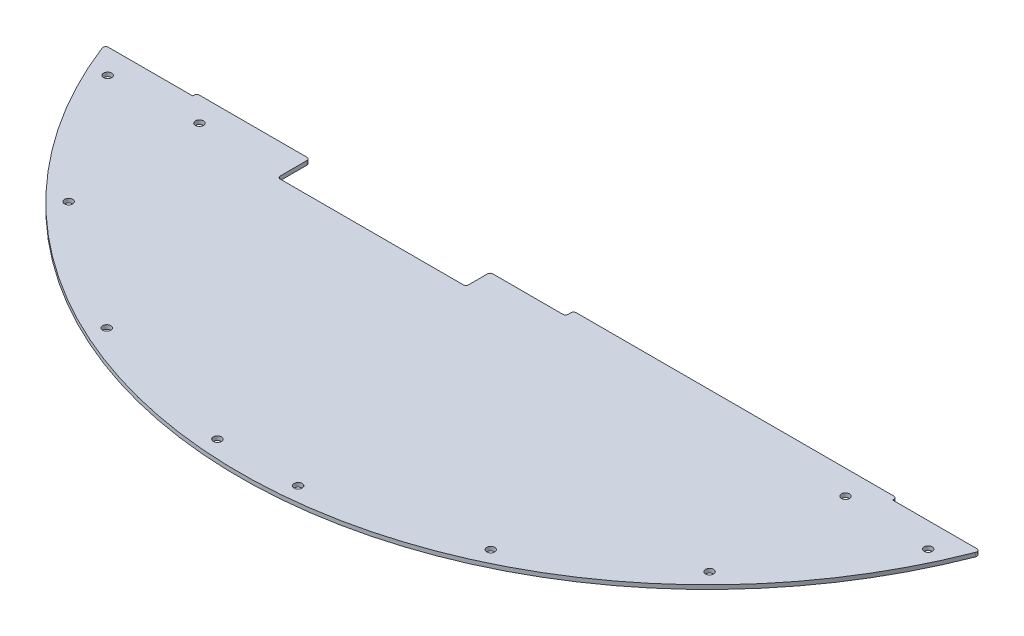
ISO-10303-21;
HEADER;
FILE_DESCRIPTION(('STEP AP214'),'2;1');
FILE_NAME('part.step','',(''),(''),'','','');
FILE_SCHEMA(('AUTOMOTIVE_DESIGN { 1 0 10303 214 1 1 1 1 }'));
ENDSEC;
DATA;
#1=APPLICATION_CONTEXT('core data for automotive mechanical design processes');
#2=APPLICATION_PROTOCOL_DEFINITION('international standard','automotive_design',2000,#1);
#3=PRODUCT_CONTEXT('',#1,'mechanical');
#4=PRODUCT('Part','Part','',(#3));
#5=PRODUCT_RELATED_PRODUCT_CATEGORY('part','',(#4));
#6=PRODUCT_DEFINITION_FORMATION('','',#4);
#7=PRODUCT_DEFINITION_CONTEXT('part definition',#1,'design');
#8=PRODUCT_DEFINITION('design','',#6,#7);
#9=PRODUCT_DEFINITION_SHAPE('','',#8);
#10=(LENGTH_UNIT() NAMED_UNIT(*) SI_UNIT(.MILLI.,.METRE.));
#11=(NAMED_UNIT(*) PLANE_ANGLE_UNIT() SI_UNIT($,.RADIAN.));
#12=(NAMED_UNIT(*) SI_UNIT($,.STERADIAN.) SOLID_ANGLE_UNIT());
#13=UNCERTAINTY_MEASURE_WITH_UNIT(LENGTH_MEASURE(1.E-05),#10,'distance_accuracy_value','');
#14=(GEOMETRIC_REPRESENTATION_CONTEXT(3) GLOBAL_UNCERTAINTY_ASSIGNED_CONTEXT((#13)) GLOBAL_UNIT_ASSIGNED_CONTEXT((#10,
#11,#12)) REPRESENTATION_CONTEXT('',''));
#15=CARTESIAN_POINT('',(0.,0.,0.));
#16=DIRECTION('',(0.,0.,1.));
#17=DIRECTION('',(1.,0.,0.));
#18=AXIS2_PLACEMENT_3D('',#15,#16,#17);
#19=CARTESIAN_POINT('',(-130.,1.5,60.));
#20=DIRECTION('',(0.,0.,1.));
#21=DIRECTION('',(1.,0.,0.));
#22=AXIS2_PLACEMENT_3D('',#19,#20,#21);
#23=PLANE('',#22);
#24=DIRECTION('',(-1.,0.,0.));
#25=VECTOR('',#24,1.);
#26=CARTESIAN_POINT('',(-130.,1.5,60.));
#27=LINE('',#26,#25);
#28=CARTESIAN_POINT('',(-89.,1.5,60.));
#29=VERTEX_POINT('',#28);
#30=CARTESIAN_POINT('',(-129.,1.5,60.));
#31=VERTEX_POINT('',#30);
#32=EDGE_CURVE('E412',#29,#31,#27,.T.);
#33=ORIENTED_EDGE('',*,*,#32,.F.);
#34=DIRECTION('',(0.,1.,0.));
#35=VECTOR('',#34,1.);
#36=CARTESIAN_POINT('',(-89.,1.5,60.));
#37=LINE('',#36,#35);
#38=CARTESIAN_POINT('',(-89.,0.,60.));
#39=VERTEX_POINT('',#38);
#40=EDGE_CURVE('E290',#29,#39,#37,.F.);
#41=ORIENTED_EDGE('',*,*,#40,.T.);
#42=DIRECTION('',(-1.,0.,0.));
#43=VECTOR('',#42,1.);
#44=CARTESIAN_POINT('',(-130.,0.,60.));
#45=LINE('',#44,#43);
#46=CARTESIAN_POINT('',(-129.,0.,60.));
#47=VERTEX_POINT('',#46);
#48=EDGE_CURVE('E424',#39,#47,#45,.T.);
#49=ORIENTED_EDGE('',*,*,#48,.T.);
#50=DIRECTION('',(0.,-1.,0.));
#51=VECTOR('',#50,1.);
#52=CARTESIAN_POINT('',(-129.,1.5,60.));
#53=LINE('',#52,#51);
#54=EDGE_CURVE('E231',#47,#31,#53,.F.);
#55=ORIENTED_EDGE('',*,*,#54,.T.);
#56=EDGE_LOOP('',(#33,#41,#49,#55));
#57=FACE_BOUND('',#56,.T.);
#58=ADVANCED_FACE('F32',(#57),#23,.F.);
#59=CARTESIAN_POINT('',(0.,1.5,0.));
#60=DIRECTION('',(0.,1.,0.));
#61=DIRECTION('',(0.,0.,1.));
#62=AXIS2_PLACEMENT_3D('',#59,#60,#61);
#63=PLANE('',#62);
#64=CARTESIAN_POINT('',(129.,1.5,60.));
#65=VERTEX_POINT('',#64);
#66=CARTESIAN_POINT('',(11.,1.5,60.));
#67=VERTEX_POINT('',#66);
#68=EDGE_CURVE('E216',#65,#67,#27,.T.);
#69=ORIENTED_EDGE('',*,*,#68,.T.);
#70=CARTESIAN_POINT('',(11.,1.5,61.));
#71=DIRECTION('',(0.,1.,0.));
#72=DIRECTION('',(0.,0.,1.));
#73=AXIS2_PLACEMENT_3D('',#70,#71,#72);
#74=CIRCLE('',#73,1.);
#75=CARTESIAN_POINT('',(10.,1.5,61.));
#76=VERTEX_POINT('',#75);
#77=EDGE_CURVE('E259',#67,#76,#74,.T.);
#78=ORIENTED_EDGE('',*,*,#77,.T.);
#79=DIRECTION('',(0.,0.,-1.));
#80=VECTOR('',#79,1.);
#81=CARTESIAN_POINT('',(10.,1.5,60.));
#82=LINE('',#81,#80);
#83=CARTESIAN_POINT('',(10.,1.5,62.));
#84=VERTEX_POINT('',#83);
#85=EDGE_CURVE('E331',#84,#76,#82,.T.);
#86=ORIENTED_EDGE('',*,*,#85,.F.);
#87=CARTESIAN_POINT('',(9.00000000000001,1.5,62.));
#88=DIRECTION('',(0.,1.,0.));
#89=DIRECTION('',(0.,0.,1.));
#90=AXIS2_PLACEMENT_3D('',#87,#88,#89);
#91=CIRCLE('',#90,1.);
#92=CARTESIAN_POINT('',(9.00000000000001,1.5,63.));
#93=VERTEX_POINT('',#92);
#94=EDGE_CURVE('E292',#84,#93,#91,.F.);
#95=ORIENTED_EDGE('',*,*,#94,.T.);
#96=DIRECTION('',(1.,0.,0.));
#97=VECTOR('',#96,1.);
#98=CARTESIAN_POINT('',(10.,1.5,63.));
#99=LINE('',#98,#97);
#100=CARTESIAN_POINT('',(-17.,1.5,63.));
#101=VERTEX_POINT('',#100);
#102=EDGE_CURVE('E342',#101,#93,#99,.T.);
#103=ORIENTED_EDGE('',*,*,#102,.F.);
#104=CARTESIAN_POINT('',(-17.,1.5,64.));
#105=DIRECTION('',(0.,1.,0.));
#106=DIRECTION('',(0.,0.,1.));
#107=AXIS2_PLACEMENT_3D('',#104,#105,#106);
#108=CIRCLE('',#107,1.);
#109=CARTESIAN_POINT('',(-18.,1.5,64.));
#110=VERTEX_POINT('',#109);
#111=EDGE_CURVE('E257',#101,#110,#108,.T.);
#112=ORIENTED_EDGE('',*,*,#111,.T.);
#113=DIRECTION('',(0.,0.,-1.));
#114=VECTOR('',#113,1.);
#115=CARTESIAN_POINT('',(-18.,1.5,72.));
#116=LINE('',#115,#114);
#117=CARTESIAN_POINT('',(-18.,1.5,71.));
#118=VERTEX_POINT('',#117);
#119=EDGE_CURVE('E339',#118,#110,#116,.T.);
#120=ORIENTED_EDGE('',*,*,#119,.F.);
#121=CARTESIAN_POINT('',(-19.,1.5,71.));
#122=DIRECTION('',(0.,1.,0.));
#123=DIRECTION('',(0.,0.,1.));
#124=AXIS2_PLACEMENT_3D('',#121,#122,#123);
#125=CIRCLE('',#124,1.);
#126=CARTESIAN_POINT('',(-19.,1.5,72.));
#127=VERTEX_POINT('',#126);
#128=EDGE_CURVE('E296',#118,#127,#125,.F.);
#129=ORIENTED_EDGE('',*,*,#128,.T.);
#130=DIRECTION('',(1.,0.,0.));
#131=VECTOR('',#130,1.);
#132=CARTESIAN_POINT('',(-88.,1.5,72.));
#133=LINE('',#132,#131);
#134=CARTESIAN_POINT('',(-87.,1.5,72.));
#135=VERTEX_POINT('',#134);
#136=EDGE_CURVE('E304',#135,#127,#133,.T.);
#137=ORIENTED_EDGE('',*,*,#136,.F.);
#138=CARTESIAN_POINT('',(-87.,1.5,71.));
#139=DIRECTION('',(0.,1.,0.));
#140=DIRECTION('',(0.,0.,1.));
#141=AXIS2_PLACEMENT_3D('',#138,#139,#140);
#142=CIRCLE('',#141,1.);
#143=CARTESIAN_POINT('',(-88.,1.5,71.));
#144=VERTEX_POINT('',#143);
#145=EDGE_CURVE('E40',#135,#144,#142,.F.);
#146=ORIENTED_EDGE('',*,*,#145,.T.);
#147=DIRECTION('',(0.,0.,1.));
#148=VECTOR('',#147,1.);
#149=CARTESIAN_POINT('',(-88.,1.5,60.));
#150=LINE('',#149,#148);
#151=CARTESIAN_POINT('',(-88.,1.5,61.));
#152=VERTEX_POINT('',#151);
#153=EDGE_CURVE('E302',#152,#144,#150,.T.);
#154=ORIENTED_EDGE('',*,*,#153,.F.);
#155=CARTESIAN_POINT('',(-89.,1.5,61.));
#156=DIRECTION('',(0.,1.,0.));
#157=DIRECTION('',(0.,0.,1.));
#158=AXIS2_PLACEMENT_3D('',#155,#156,#157);
#159=CIRCLE('',#158,1.);
#160=EDGE_CURVE('E255',#152,#29,#159,.T.);
#161=ORIENTED_EDGE('',*,*,#160,.T.);
#162=ORIENTED_EDGE('',*,*,#32,.T.);
#163=CARTESIAN_POINT('',(-129.,1.5,61.));
#164=DIRECTION('',(0.,1.,0.));
#165=DIRECTION('',(0.,0.,1.));
#166=AXIS2_PLACEMENT_3D('',#163,#164,#165);
#167=CIRCLE('',#166,1.);
#168=CARTESIAN_POINT('',(-130.,1.5,61.));
#169=VERTEX_POINT('',#168);
#170=EDGE_CURVE('E190',#31,#169,#167,.T.);
#171=ORIENTED_EDGE('',*,*,#170,.T.);
#172=DIRECTION('',(0.,0.,1.));
#173=VECTOR('',#172,1.);
#174=CARTESIAN_POINT('',(-130.,1.5,60.));
#175=LINE('',#174,#173);
#176=CARTESIAN_POINT('',(-130.,1.5,61.5));
#177=VERTEX_POINT('',#176);
#178=EDGE_CURVE('E182',#169,#177,#175,.T.);
#179=ORIENTED_EDGE('',*,*,#178,.T.);
#180=DIRECTION('',(-1.,0.,0.));
#181=VECTOR('',#180,1.);
#182=CARTESIAN_POINT('',(-162.76900810658,1.5,61.5));
#183=LINE('',#182,#181);
#184=CARTESIAN_POINT('',(-161.315684296351,1.5,61.5));
#185=VERTEX_POINT('',#184);
#186=EDGE_CURVE('E187',#177,#185,#183,.T.);
#187=ORIENTED_EDGE('',*,*,#186,.T.);
#188=CARTESIAN_POINT('',(-161.315684296351,1.5,62.5));
#189=DIRECTION('',(0.,1.,0.));
#190=DIRECTION('',(0.,0.,1.));
#191=AXIS2_PLACEMENT_3D('',#188,#189,#190);
#192=CIRCLE('',#191,1.);
#193=CARTESIAN_POINT('',(-162.24814489922,1.5,62.8612716763006));
#194=VERTEX_POINT('',#193);
#195=EDGE_CURVE('E238',#185,#194,#192,.T.);
#196=ORIENTED_EDGE('',*,*,#195,.T.);
#197=CARTESIAN_POINT('',(0.,1.5,0.));
#198=DIRECTION('',(0.,1.,0.));
#199=DIRECTION('',(0.,0.,1.));
#200=AXIS2_PLACEMENT_3D('',#197,#198,#199);
#201=CIRCLE('',#200,174.);
#202=CARTESIAN_POINT('',(162.24814489922,1.5,62.8612716763006));
#203=VERTEX_POINT('',#202);
#204=EDGE_CURVE('E204',#194,#203,#201,.T.);
#205=ORIENTED_EDGE('',*,*,#204,.T.);
#206=CARTESIAN_POINT('',(161.315684296351,1.5,62.5));
#207=DIRECTION('',(0.,1.,0.));
#208=DIRECTION('',(0.,0.,1.));
#209=AXIS2_PLACEMENT_3D('',#206,#207,#208);
#210=CIRCLE('',#209,1.);
#211=CARTESIAN_POINT('',(161.315684296351,1.5,61.5));
#212=VERTEX_POINT('',#211);
#213=EDGE_CURVE('E234',#203,#212,#210,.T.);
#214=ORIENTED_EDGE('',*,*,#213,.T.);
#215=DIRECTION('',(-1.,0.,0.));
#216=VECTOR('',#215,1.);
#217=CARTESIAN_POINT('',(162.76900810658,1.5,61.5));
#218=LINE('',#217,#216);
#219=CARTESIAN_POINT('',(130.,1.5,61.5));
#220=VERTEX_POINT('',#219);
#221=EDGE_CURVE('E407',#212,#220,#218,.T.);
#222=ORIENTED_EDGE('',*,*,#221,.T.);
#223=DIRECTION('',(0.,0.,-1.));
#224=VECTOR('',#223,1.);
#225=CARTESIAN_POINT('',(130.,1.5,60.));
#226=LINE('',#225,#224);
#227=CARTESIAN_POINT('',(130.,1.5,61.));
#228=VERTEX_POINT('',#227);
#229=EDGE_CURVE('E409',#220,#228,#226,.T.);
#230=ORIENTED_EDGE('',*,*,#229,.T.);
#231=CARTESIAN_POINT('',(129.,1.5,61.));
#232=DIRECTION('',(0.,1.,0.));
#233=DIRECTION('',(0.,0.,1.));
#234=AXIS2_PLACEMENT_3D('',#231,#232,#233);
#235=CIRCLE('',#234,1.);
#236=EDGE_CURVE('E236',#228,#65,#235,.T.);
#237=ORIENTED_EDGE('',*,*,#236,.T.);
#238=EDGE_LOOP('',(#69,#78,#86,#95,#103,#112,#120,#129,#137,#146,#154,#161,#162,#171,#179,#187,
#196,#205,#214,#222,#230,#237));
#239=FACE_BOUND('',#238,.T.);
#240=CARTESIAN_POINT('',(15.,1.5,167.329017208612));
#241=DIRECTION('',(0.,-1.,0.));
#242=DIRECTION('',(0.,0.,1.));
#243=AXIS2_PLACEMENT_3D('',#240,#241,#242);
#244=CIRCLE('',#243,1.5);
#245=CARTESIAN_POINT('',(15.,1.5,168.829017208612));
#246=VERTEX_POINT('',#245);
#247=EDGE_CURVE('E350',#246,#246,#244,.T.);
#248=ORIENTED_EDGE('',*,*,#247,.T.);
#249=EDGE_LOOP('',(#248));
#250=FACE_BOUND('',#249,.T.);
#251=CARTESIAN_POINT('',(71.3252837600215,1.5,152.107540564406));
#252=DIRECTION('',(0.,-1.,0.));
#253=DIRECTION('',(0.342020143325669,0.,0.939692620785908));
#254=AXIS2_PLACEMENT_3D('',#251,#252,#253);
#255=CIRCLE('',#254,1.5);
#256=CARTESIAN_POINT('',(71.83831397501,1.5,153.517079495585));
#257=VERTEX_POINT('',#256);
#258=EDGE_CURVE('E356',#257,#257,#255,.T.);
#259=ORIENTED_EDGE('',*,*,#258,.T.);
#260=EDGE_LOOP('',(#259));
#261=FACE_BOUND('',#260,.T.);
#262=CARTESIAN_POINT('',(119.047685649506,1.5,118.539649659919));
#263=DIRECTION('',(0.,-1.,0.));
#264=DIRECTION('',(0.642787609686541,0.,0.766044443118977));
#265=AXIS2_PLACEMENT_3D('',#262,#263,#264);
#266=CIRCLE('',#265,1.5);
#267=CARTESIAN_POINT('',(120.011867064036,1.5,119.688716324597));
#268=VERTEX_POINT('',#267);
#269=EDGE_CURVE('E362',#268,#268,#266,.T.);
#270=ORIENTED_EDGE('',*,*,#269,.T.);
#271=EDGE_LOOP('',(#270));
#272=FACE_BOUND('',#271,.T.);
#273=CARTESIAN_POINT('',(152.411179692942,1.5,70.6741275475391));
#274=DIRECTION('',(0.,-1.,0.));
#275=DIRECTION('',(0.86602540378444,0.,0.499999999999998));
#276=AXIS2_PLACEMENT_3D('',#273,#274,#275);
#277=CIRCLE('',#276,1.5);
#278=CARTESIAN_POINT('',(153.710217798618,1.5,71.4241275475391));
#279=VERTEX_POINT('',#278);
#280=EDGE_CURVE('E336',#279,#279,#277,.T.);
#281=ORIENTED_EDGE('',*,*,#280,.T.);
#282=EDGE_LOOP('',(#281));
#283=FACE_BOUND('',#282,.T.);
#284=CARTESIAN_POINT('',(-71.3252837600215,1.5,152.107540564406));
#285=DIRECTION('',(0.,1.,0.));
#286=DIRECTION('',(-0.342020143325669,0.,0.939692620785908));
#287=AXIS2_PLACEMENT_3D('',#284,#285,#286);
#288=CIRCLE('',#287,1.5);
#289=CARTESIAN_POINT('',(-71.83831397501,1.5,153.517079495585));
#290=VERTEX_POINT('',#289);
#291=EDGE_CURVE('E374',#290,#290,#288,.T.);
#292=ORIENTED_EDGE('',*,*,#291,.F.);
#293=EDGE_LOOP('',(#292));
#294=FACE_BOUND('',#293,.T.);
#295=CARTESIAN_POINT('',(-119.047685649506,1.5,118.539649659919));
#296=DIRECTION('',(0.,1.,0.));
#297=DIRECTION('',(-0.642787609686541,0.,0.766044443118977));
#298=AXIS2_PLACEMENT_3D('',#295,#296,#297);
#299=CIRCLE('',#298,1.5);
#300=CARTESIAN_POINT('',(-120.011867064036,1.5,119.688716324597));
#301=VERTEX_POINT('',#300);
#302=EDGE_CURVE('E380',#301,#301,#299,.T.);
#303=ORIENTED_EDGE('',*,*,#302,.F.);
#304=EDGE_LOOP('',(#303));
#305=FACE_BOUND('',#304,.T.);
#306=CARTESIAN_POINT('',(-152.411179692942,1.5,70.6741275475391));
#307=DIRECTION('',(0.,1.,0.));
#308=DIRECTION('',(-0.86602540378444,0.,0.499999999999998));
#309=AXIS2_PLACEMENT_3D('',#306,#307,#308);
#310=CIRCLE('',#309,1.5);
#311=CARTESIAN_POINT('',(-153.710217798618,1.5,71.4241275475391));
#312=VERTEX_POINT('',#311);
#313=EDGE_CURVE('E349',#312,#312,#310,.T.);
#314=ORIENTED_EDGE('',*,*,#313,.F.);
#315=EDGE_LOOP('',(#314));
#316=FACE_BOUND('',#315,.T.);
#317=CARTESIAN_POINT('',(-15.,1.5,167.329017208612));
#318=DIRECTION('',(0.,1.,0.));
#319=DIRECTION('',(0.,0.,1.));
#320=AXIS2_PLACEMENT_3D('',#317,#318,#319);
#321=CIRCLE('',#320,1.5);
#322=CARTESIAN_POINT('',(-15.,1.5,168.829017208612));
#323=VERTEX_POINT('',#322);
#324=EDGE_CURVE('E373',#323,#323,#321,.T.);
#325=ORIENTED_EDGE('',*,*,#324,.F.);
#326=EDGE_LOOP('',(#325));
#327=FACE_BOUND('',#326,.T.);
#328=CARTESIAN_POINT('',(-120.,1.5,69.));
#329=DIRECTION('',(0.,1.,0.));
#330=DIRECTION('',(0.,0.,1.));
#331=AXIS2_PLACEMENT_3D('',#328,#329,#330);
#332=CIRCLE('',#331,1.5);
#333=CARTESIAN_POINT('',(-120.,1.5,70.5));
#334=VERTEX_POINT('',#333);
#335=EDGE_CURVE('E400',#334,#334,#332,.T.);
#336=ORIENTED_EDGE('',*,*,#335,.F.);
#337=EDGE_LOOP('',(#336));
#338=FACE_BOUND('',#337,.T.);
#339=CARTESIAN_POINT('',(120.,1.5,69.));
#340=DIRECTION('',(0.,1.,0.));
#341=DIRECTION('',(0.,0.,-1.));
#342=AXIS2_PLACEMENT_3D('',#339,#340,#341);
#343=CIRCLE('',#342,1.5);
#344=CARTESIAN_POINT('',(120.,1.5,67.5));
#345=VERTEX_POINT('',#344);
#346=EDGE_CURVE('E394',#345,#345,#343,.T.);
#347=ORIENTED_EDGE('',*,*,#346,.F.);
#348=EDGE_LOOP('',(#347));
#349=FACE_BOUND('',#348,.T.);
#350=ADVANCED_FACE('F185',(#239,#250,#261,#272,#283,#294,#305,#316,#327,#338,#349),#63,.T.);
#351=CARTESIAN_POINT('',(0.,0.,0.));
#352=DIRECTION('',(0.,1.,0.));
#353=DIRECTION('',(0.,0.,1.));
#354=AXIS2_PLACEMENT_3D('',#351,#352,#353);
#355=PLANE('',#354);
#356=DIRECTION('',(0.,0.,-1.));
#357=VECTOR('',#356,1.);
#358=CARTESIAN_POINT('',(10.,0.,60.));
#359=LINE('',#358,#357);
#360=CARTESIAN_POINT('',(10.,0.,62.));
#361=VERTEX_POINT('',#360);
#362=CARTESIAN_POINT('',(10.,0.,61.));
#363=VERTEX_POINT('',#362);
#364=EDGE_CURVE('E335',#361,#363,#359,.T.);
#365=ORIENTED_EDGE('',*,*,#364,.T.);
#366=CARTESIAN_POINT('',(11.,0.,61.));
#367=DIRECTION('',(0.,1.,0.));
#368=DIRECTION('',(0.,0.,1.));
#369=AXIS2_PLACEMENT_3D('',#366,#367,#368);
#370=CIRCLE('',#369,1.);
#371=CARTESIAN_POINT('',(11.,0.,60.));
#372=VERTEX_POINT('',#371);
#373=EDGE_CURVE('E269',#363,#372,#370,.F.);
#374=ORIENTED_EDGE('',*,*,#373,.T.);
#375=CARTESIAN_POINT('',(129.,0.,60.));
#376=VERTEX_POINT('',#375);
#377=EDGE_CURVE('E195',#376,#372,#45,.T.);
#378=ORIENTED_EDGE('',*,*,#377,.F.);
#379=CARTESIAN_POINT('',(129.,0.,61.));
#380=DIRECTION('',(0.,1.,0.));
#381=DIRECTION('',(0.,0.,1.));
#382=AXIS2_PLACEMENT_3D('',#379,#380,#381);
#383=CIRCLE('',#382,1.);
#384=CARTESIAN_POINT('',(130.,0.,61.));
#385=VERTEX_POINT('',#384);
#386=EDGE_CURVE('E221',#376,#385,#383,.F.);
#387=ORIENTED_EDGE('',*,*,#386,.T.);
#388=DIRECTION('',(0.,0.,-1.));
#389=VECTOR('',#388,1.);
#390=CARTESIAN_POINT('',(130.,0.,60.));
#391=LINE('',#390,#389);
#392=CARTESIAN_POINT('',(130.,0.,61.5));
#393=VERTEX_POINT('',#392);
#394=EDGE_CURVE('E422',#393,#385,#391,.T.);
#395=ORIENTED_EDGE('',*,*,#394,.F.);
#396=DIRECTION('',(-1.,0.,0.));
#397=VECTOR('',#396,1.);
#398=CARTESIAN_POINT('',(162.76900810658,0.,61.5));
#399=LINE('',#398,#397);
#400=CARTESIAN_POINT('',(161.315684296351,0.,61.5));
#401=VERTEX_POINT('',#400);
#402=EDGE_CURVE('E420',#401,#393,#399,.T.);
#403=ORIENTED_EDGE('',*,*,#402,.F.);
#404=CARTESIAN_POINT('',(161.315684296351,0.,62.5));
#405=DIRECTION('',(0.,1.,0.));
#406=DIRECTION('',(0.,0.,1.));
#407=AXIS2_PLACEMENT_3D('',#404,#405,#406);
#408=CIRCLE('',#407,1.);
#409=CARTESIAN_POINT('',(162.24814489922,0.,62.8612716763006));
#410=VERTEX_POINT('',#409);
#411=EDGE_CURVE('E213',#401,#410,#408,.F.);
#412=ORIENTED_EDGE('',*,*,#411,.T.);
#413=CARTESIAN_POINT('',(0.,0.,0.));
#414=DIRECTION('',(0.,1.,0.));
#415=DIRECTION('',(0.,0.,1.));
#416=AXIS2_PLACEMENT_3D('',#413,#414,#415);
#417=CIRCLE('',#416,174.);
#418=CARTESIAN_POINT('',(-162.24814489922,0.,62.8612716763006));
#419=VERTEX_POINT('',#418);
#420=EDGE_CURVE('E417',#419,#410,#417,.T.);
#421=ORIENTED_EDGE('',*,*,#420,.F.);
#422=CARTESIAN_POINT('',(-161.315684296351,0.,62.5));
#423=DIRECTION('',(0.,1.,0.));
#424=DIRECTION('',(0.,0.,1.));
#425=AXIS2_PLACEMENT_3D('',#422,#423,#424);
#426=CIRCLE('',#425,1.);
#427=CARTESIAN_POINT('',(-161.315684296351,0.,61.5));
#428=VERTEX_POINT('',#427);
#429=EDGE_CURVE('E223',#419,#428,#426,.F.);
#430=ORIENTED_EDGE('',*,*,#429,.T.);
#431=DIRECTION('',(-1.,0.,0.));
#432=VECTOR('',#431,1.);
#433=CARTESIAN_POINT('',(-162.76900810658,0.,61.5));
#434=LINE('',#433,#432);
#435=CARTESIAN_POINT('',(-130.,0.,61.5));
#436=VERTEX_POINT('',#435);
#437=EDGE_CURVE('E415',#436,#428,#434,.T.);
#438=ORIENTED_EDGE('',*,*,#437,.F.);
#439=DIRECTION('',(0.,0.,1.));
#440=VECTOR('',#439,1.);
#441=CARTESIAN_POINT('',(-130.,0.,60.));
#442=LINE('',#441,#440);
#443=CARTESIAN_POINT('',(-130.,0.,61.));
#444=VERTEX_POINT('',#443);
#445=EDGE_CURVE('E208',#444,#436,#442,.T.);
#446=ORIENTED_EDGE('',*,*,#445,.F.);
#447=CARTESIAN_POINT('',(-129.,0.,61.));
#448=DIRECTION('',(0.,1.,0.));
#449=DIRECTION('',(0.,0.,1.));
#450=AXIS2_PLACEMENT_3D('',#447,#448,#449);
#451=CIRCLE('',#450,1.);
#452=EDGE_CURVE('E225',#444,#47,#451,.F.);
#453=ORIENTED_EDGE('',*,*,#452,.T.);
#454=ORIENTED_EDGE('',*,*,#48,.F.);
#455=CARTESIAN_POINT('',(-89.,0.,61.));
#456=DIRECTION('',(0.,1.,0.));
#457=DIRECTION('',(0.,0.,1.));
#458=AXIS2_PLACEMENT_3D('',#455,#456,#457);
#459=CIRCLE('',#458,1.);
#460=CARTESIAN_POINT('',(-88.,0.,61.));
#461=VERTEX_POINT('',#460);
#462=EDGE_CURVE('E266',#39,#461,#459,.F.);
#463=ORIENTED_EDGE('',*,*,#462,.T.);
#464=DIRECTION('',(0.,0.,1.));
#465=VECTOR('',#464,1.);
#466=CARTESIAN_POINT('',(-88.,0.,60.));
#467=LINE('',#466,#465);
#468=CARTESIAN_POINT('',(-88.,0.,71.));
#469=VERTEX_POINT('',#468);
#470=EDGE_CURVE('E323',#461,#469,#467,.T.);
#471=ORIENTED_EDGE('',*,*,#470,.T.);
#472=CARTESIAN_POINT('',(-87.,0.,71.));
#473=DIRECTION('',(0.,1.,0.));
#474=DIRECTION('',(0.,0.,1.));
#475=AXIS2_PLACEMENT_3D('',#472,#473,#474);
#476=CIRCLE('',#475,1.);
#477=CARTESIAN_POINT('',(-87.,0.,72.));
#478=VERTEX_POINT('',#477);
#479=EDGE_CURVE('E11',#469,#478,#476,.T.);
#480=ORIENTED_EDGE('',*,*,#479,.T.);
#481=DIRECTION('',(1.,0.,0.));
#482=VECTOR('',#481,1.);
#483=CARTESIAN_POINT('',(-88.,0.,72.));
#484=LINE('',#483,#482);
#485=CARTESIAN_POINT('',(-19.,0.,72.));
#486=VERTEX_POINT('',#485);
#487=EDGE_CURVE('E321',#478,#486,#484,.T.);
#488=ORIENTED_EDGE('',*,*,#487,.T.);
#489=CARTESIAN_POINT('',(-19.,0.,71.));
#490=DIRECTION('',(0.,1.,0.));
#491=DIRECTION('',(0.,0.,1.));
#492=AXIS2_PLACEMENT_3D('',#489,#490,#491);
#493=CIRCLE('',#492,1.);
#494=CARTESIAN_POINT('',(-18.,0.,71.));
#495=VERTEX_POINT('',#494);
#496=EDGE_CURVE('E298',#486,#495,#493,.T.);
#497=ORIENTED_EDGE('',*,*,#496,.T.);
#498=DIRECTION('',(0.,0.,-1.));
#499=VECTOR('',#498,1.);
#500=CARTESIAN_POINT('',(-18.,0.,72.));
#501=LINE('',#500,#499);
#502=CARTESIAN_POINT('',(-18.,0.,64.));
#503=VERTEX_POINT('',#502);
#504=EDGE_CURVE('E327',#495,#503,#501,.T.);
#505=ORIENTED_EDGE('',*,*,#504,.T.);
#506=CARTESIAN_POINT('',(-17.,0.,64.));
#507=DIRECTION('',(0.,1.,0.));
#508=DIRECTION('',(0.,0.,1.));
#509=AXIS2_PLACEMENT_3D('',#506,#507,#508);
#510=CIRCLE('',#509,1.);
#511=CARTESIAN_POINT('',(-17.,0.,63.));
#512=VERTEX_POINT('',#511);
#513=EDGE_CURVE('E54',#503,#512,#510,.F.);
#514=ORIENTED_EDGE('',*,*,#513,.T.);
#515=DIRECTION('',(1.,0.,0.));
#516=VECTOR('',#515,1.);
#517=CARTESIAN_POINT('',(10.,0.,63.));
#518=LINE('',#517,#516);
#519=CARTESIAN_POINT('',(9.00000000000001,0.,63.));
#520=VERTEX_POINT('',#519);
#521=EDGE_CURVE('E329',#512,#520,#518,.T.);
#522=ORIENTED_EDGE('',*,*,#521,.T.);
#523=CARTESIAN_POINT('',(9.00000000000001,0.,62.));
#524=DIRECTION('',(0.,1.,0.));
#525=DIRECTION('',(0.,0.,1.));
#526=AXIS2_PLACEMENT_3D('',#523,#524,#525);
#527=CIRCLE('',#526,1.);
#528=EDGE_CURVE('E294',#520,#361,#527,.T.);
#529=ORIENTED_EDGE('',*,*,#528,.T.);
#530=EDGE_LOOP('',(#365,#374,#378,#387,#395,#403,#412,#421,#430,#438,#446,#453,#454,#463,#471,
#480,#488,#497,#505,#514,#522,#529));
#531=FACE_BOUND('',#530,.T.);
#532=CARTESIAN_POINT('',(15.,0.,167.329017208612));
#533=DIRECTION('',(0.,-1.,0.));
#534=DIRECTION('',(0.,0.,1.));
#535=AXIS2_PLACEMENT_3D('',#532,#533,#534);
#536=CIRCLE('',#535,1.5);
#537=CARTESIAN_POINT('',(15.,0.,168.829017208612));
#538=VERTEX_POINT('',#537);
#539=EDGE_CURVE('E346',#538,#538,#536,.T.);
#540=ORIENTED_EDGE('',*,*,#539,.F.);
#541=EDGE_LOOP('',(#540));
#542=FACE_BOUND('',#541,.T.);
#543=CARTESIAN_POINT('',(71.3252837600215,0.,152.107540564406));
#544=DIRECTION('',(0.,-1.,0.));
#545=DIRECTION('',(0.342020143325669,0.,0.939692620785908));
#546=AXIS2_PLACEMENT_3D('',#543,#544,#545);
#547=CIRCLE('',#546,1.5);
#548=CARTESIAN_POINT('',(71.83831397501,0.,153.517079495585));
#549=VERTEX_POINT('',#548);
#550=EDGE_CURVE('E353',#549,#549,#547,.T.);
#551=ORIENTED_EDGE('',*,*,#550,.F.);
#552=EDGE_LOOP('',(#551));
#553=FACE_BOUND('',#552,.T.);
#554=CARTESIAN_POINT('',(119.047685649506,0.,118.539649659919));
#555=DIRECTION('',(0.,-1.,0.));
#556=DIRECTION('',(0.642787609686541,0.,0.766044443118977));
#557=AXIS2_PLACEMENT_3D('',#554,#555,#556);
#558=CIRCLE('',#557,1.5);
#559=CARTESIAN_POINT('',(120.011867064036,0.,119.688716324597));
#560=VERTEX_POINT('',#559);
#561=EDGE_CURVE('E359',#560,#560,#558,.T.);
#562=ORIENTED_EDGE('',*,*,#561,.F.);
#563=EDGE_LOOP('',(#562));
#564=FACE_BOUND('',#563,.T.);
#565=CARTESIAN_POINT('',(152.411179692942,0.,70.6741275475391));
#566=DIRECTION('',(0.,-1.,0.));
#567=DIRECTION('',(0.86602540378444,0.,0.499999999999998));
#568=AXIS2_PLACEMENT_3D('',#565,#566,#567);
#569=CIRCLE('',#568,1.5);
#570=CARTESIAN_POINT('',(153.710217798618,0.,71.4241275475391));
#571=VERTEX_POINT('',#570);
#572=EDGE_CURVE('E365',#571,#571,#569,.T.);
#573=ORIENTED_EDGE('',*,*,#572,.F.);
#574=EDGE_LOOP('',(#573));
#575=FACE_BOUND('',#574,.T.);
#576=CARTESIAN_POINT('',(-71.3252837600215,0.,152.107540564406));
#577=DIRECTION('',(0.,1.,0.));
#578=DIRECTION('',(-0.342020143325669,0.,0.939692620785908));
#579=AXIS2_PLACEMENT_3D('',#576,#577,#578);
#580=CIRCLE('',#579,1.5);
#581=CARTESIAN_POINT('',(-71.83831397501,0.,153.517079495585));
#582=VERTEX_POINT('',#581);
#583=EDGE_CURVE('E370',#582,#582,#580,.T.);
#584=ORIENTED_EDGE('',*,*,#583,.T.);
#585=EDGE_LOOP('',(#584));
#586=FACE_BOUND('',#585,.T.);
#587=CARTESIAN_POINT('',(-119.047685649506,0.,118.539649659919));
#588=DIRECTION('',(0.,1.,0.));
#589=DIRECTION('',(-0.642787609686541,0.,0.766044443118977));
#590=AXIS2_PLACEMENT_3D('',#587,#588,#589);
#591=CIRCLE('',#590,1.5);
#592=CARTESIAN_POINT('',(-120.011867064036,0.,119.688716324597));
#593=VERTEX_POINT('',#592);
#594=EDGE_CURVE('E377',#593,#593,#591,.T.);
#595=ORIENTED_EDGE('',*,*,#594,.T.);
#596=EDGE_LOOP('',(#595));
#597=FACE_BOUND('',#596,.T.);
#598=CARTESIAN_POINT('',(-152.411179692942,0.,70.6741275475391));
#599=DIRECTION('',(0.,1.,0.));
#600=DIRECTION('',(-0.86602540378444,0.,0.499999999999998));
#601=AXIS2_PLACEMENT_3D('',#598,#599,#600);
#602=CIRCLE('',#601,1.5);
#603=CARTESIAN_POINT('',(-153.710217798618,0.,71.4241275475391));
#604=VERTEX_POINT('',#603);
#605=EDGE_CURVE('E383',#604,#604,#602,.T.);
#606=ORIENTED_EDGE('',*,*,#605,.T.);
#607=EDGE_LOOP('',(#606));
#608=FACE_BOUND('',#607,.T.);
#609=CARTESIAN_POINT('',(-15.,0.,167.329017208612));
#610=DIRECTION('',(0.,1.,0.));
#611=DIRECTION('',(0.,0.,1.));
#612=AXIS2_PLACEMENT_3D('',#609,#610,#611);
#613=CIRCLE('',#612,1.5);
#614=CARTESIAN_POINT('',(-15.,0.,168.829017208612));
#615=VERTEX_POINT('',#614);
#616=EDGE_CURVE('E388',#615,#615,#613,.T.);
#617=ORIENTED_EDGE('',*,*,#616,.T.);
#618=EDGE_LOOP('',(#617));
#619=FACE_BOUND('',#618,.T.);
#620=CARTESIAN_POINT('',(-120.,0.,69.));
#621=DIRECTION('',(0.,1.,0.));
#622=DIRECTION('',(0.,0.,1.));
#623=AXIS2_PLACEMENT_3D('',#620,#621,#622);
#624=CIRCLE('',#623,1.5);
#625=CARTESIAN_POINT('',(-120.,0.,70.5));
#626=VERTEX_POINT('',#625);
#627=EDGE_CURVE('E397',#626,#626,#624,.T.);
#628=ORIENTED_EDGE('',*,*,#627,.T.);
#629=EDGE_LOOP('',(#628));
#630=FACE_BOUND('',#629,.T.);
#631=CARTESIAN_POINT('',(120.,0.,69.));
#632=DIRECTION('',(0.,1.,0.));
#633=DIRECTION('',(0.,0.,-1.));
#634=AXIS2_PLACEMENT_3D('',#631,#632,#633);
#635=CIRCLE('',#634,1.5);
#636=CARTESIAN_POINT('',(120.,0.,67.5));
#637=VERTEX_POINT('',#636);
#638=EDGE_CURVE('E391',#637,#637,#635,.T.);
#639=ORIENTED_EDGE('',*,*,#638,.T.);
#640=EDGE_LOOP('',(#639));
#641=FACE_BOUND('',#640,.T.);
#642=ADVANCED_FACE('F319',(#531,#542,#553,#564,#575,#586,#597,#608,#619,#630,#641),#355,.F.);
#643=CARTESIAN_POINT('',(-130.,1.5,60.));
#644=DIRECTION('',(1.,0.,0.));
#645=DIRECTION('',(0.,0.,-1.));
#646=AXIS2_PLACEMENT_3D('',#643,#644,#645);
#647=PLANE('',#646);
#648=ORIENTED_EDGE('',*,*,#178,.F.);
#649=DIRECTION('',(0.,-1.,0.));
#650=VECTOR('',#649,1.);
#651=CARTESIAN_POINT('',(-130.,1.5,61.));
#652=LINE('',#651,#650);
#653=EDGE_CURVE('E210',#169,#444,#652,.T.);
#654=ORIENTED_EDGE('',*,*,#653,.T.);
#655=ORIENTED_EDGE('',*,*,#445,.T.);
#656=DIRECTION('',(0.,-1.,0.));
#657=VECTOR('',#656,1.);
#658=CARTESIAN_POINT('',(-130.,1.5,61.5));
#659=LINE('',#658,#657);
#660=EDGE_CURVE('E201',#177,#436,#659,.T.);
#661=ORIENTED_EDGE('',*,*,#660,.F.);
#662=EDGE_LOOP('',(#648,#654,#655,#661));
#663=FACE_BOUND('',#662,.T.);
#664=ADVANCED_FACE('F206',(#663),#647,.F.);
#665=CARTESIAN_POINT('',(-162.76900810658,1.5,61.5));
#666=DIRECTION('',(0.,0.,1.));
#667=DIRECTION('',(1.,0.,0.));
#668=AXIS2_PLACEMENT_3D('',#665,#666,#667);
#669=PLANE('',#668);
#670=ORIENTED_EDGE('',*,*,#437,.T.);
#671=DIRECTION('',(0.,-1.,0.));
#672=VECTOR('',#671,1.);
#673=CARTESIAN_POINT('',(-161.315684296351,1.5,61.5));
#674=LINE('',#673,#672);
#675=EDGE_CURVE('E203',#428,#185,#674,.F.);
#676=ORIENTED_EDGE('',*,*,#675,.T.);
#677=ORIENTED_EDGE('',*,*,#186,.F.);
#678=ORIENTED_EDGE('',*,*,#660,.T.);
#679=EDGE_LOOP('',(#670,#676,#677,#678));
#680=FACE_BOUND('',#679,.T.);
#681=ADVANCED_FACE('F200',(#680),#669,.F.);
#682=CARTESIAN_POINT('',(0.,1.5,0.));
#683=DIRECTION('',(0.,-1.,0.));
#684=DIRECTION('',(0.,0.,-1.));
#685=AXIS2_PLACEMENT_3D('',#682,#683,#684);
#686=CYLINDRICAL_SURFACE('',#685,174.);
#687=ORIENTED_EDGE('',*,*,#204,.F.);
#688=DIRECTION('',(0.,-1.,0.));
#689=VECTOR('',#688,1.);
#690=CARTESIAN_POINT('',(-162.24814489922,1.5,62.8612716763006));
#691=LINE('',#690,#689);
#692=EDGE_CURVE('E243',#194,#419,#691,.T.);
#693=ORIENTED_EDGE('',*,*,#692,.T.);
#694=ORIENTED_EDGE('',*,*,#420,.T.);
#695=DIRECTION('',(0.,-1.,0.));
#696=VECTOR('',#695,1.);
#697=CARTESIAN_POINT('',(162.24814489922,1.5,62.8612716763006));
#698=LINE('',#697,#696);
#699=EDGE_CURVE('E241',#410,#203,#698,.F.);
#700=ORIENTED_EDGE('',*,*,#699,.T.);
#701=EDGE_LOOP('',(#687,#693,#694,#700));
#702=FACE_BOUND('',#701,.T.);
#703=ADVANCED_FACE('F474',(#702),#686,.T.);
#704=CARTESIAN_POINT('',(162.76900810658,1.5,61.5));
#705=DIRECTION('',(0.,0.,1.));
#706=DIRECTION('',(1.,0.,0.));
#707=AXIS2_PLACEMENT_3D('',#704,#705,#706);
#708=PLANE('',#707);
#709=ORIENTED_EDGE('',*,*,#221,.F.);
#710=DIRECTION('',(0.,-1.,0.));
#711=VECTOR('',#710,1.);
#712=CARTESIAN_POINT('',(161.315684296351,1.5,61.5));
#713=LINE('',#712,#711);
#714=EDGE_CURVE('E249',#212,#401,#713,.T.);
#715=ORIENTED_EDGE('',*,*,#714,.T.);
#716=ORIENTED_EDGE('',*,*,#402,.T.);
#717=DIRECTION('',(0.,-1.,0.));
#718=VECTOR('',#717,1.);
#719=CARTESIAN_POINT('',(130.,1.5,61.5));
#720=LINE('',#719,#718);
#721=EDGE_CURVE('E211',#220,#393,#720,.T.);
#722=ORIENTED_EDGE('',*,*,#721,.F.);
#723=EDGE_LOOP('',(#709,#715,#716,#722));
#724=FACE_BOUND('',#723,.T.);
#725=ADVANCED_FACE('F469',(#724),#708,.F.);
#726=CARTESIAN_POINT('',(130.,1.5,60.));
#727=DIRECTION('',(-1.,0.,0.));
#728=DIRECTION('',(0.,0.,1.));
#729=AXIS2_PLACEMENT_3D('',#726,#727,#728);
#730=PLANE('',#729);
#731=ORIENTED_EDGE('',*,*,#394,.T.);
#732=DIRECTION('',(0.,-1.,0.));
#733=VECTOR('',#732,1.);
#734=CARTESIAN_POINT('',(130.,1.5,61.));
#735=LINE('',#734,#733);
#736=EDGE_CURVE('E247',#385,#228,#735,.F.);
#737=ORIENTED_EDGE('',*,*,#736,.T.);
#738=ORIENTED_EDGE('',*,*,#229,.F.);
#739=ORIENTED_EDGE('',*,*,#721,.T.);
#740=EDGE_LOOP('',(#731,#737,#738,#739));
#741=FACE_BOUND('',#740,.T.);
#742=ADVANCED_FACE('F462',(#741),#730,.F.);
#743=ORIENTED_EDGE('',*,*,#377,.T.);
#744=DIRECTION('',(0.,1.,0.));
#745=VECTOR('',#744,1.);
#746=CARTESIAN_POINT('',(11.,1.5,60.));
#747=LINE('',#746,#745);
#748=EDGE_CURVE('E252',#372,#67,#747,.T.);
#749=ORIENTED_EDGE('',*,*,#748,.T.);
#750=ORIENTED_EDGE('',*,*,#68,.F.);
#751=DIRECTION('',(0.,-1.,0.));
#752=VECTOR('',#751,1.);
#753=CARTESIAN_POINT('',(129.,1.5,60.));
#754=LINE('',#753,#752);
#755=EDGE_CURVE('E228',#65,#376,#754,.T.);
#756=ORIENTED_EDGE('',*,*,#755,.T.);
#757=EDGE_LOOP('',(#743,#749,#750,#756));
#758=FACE_BOUND('',#757,.T.);
#759=ADVANCED_FACE('F454',(#758),#23,.F.);
#760=CARTESIAN_POINT('',(-120.,1.5,69.));
#761=DIRECTION('',(0.,-1.,0.));
#762=DIRECTION('',(0.,0.,-1.));
#763=AXIS2_PLACEMENT_3D('',#760,#761,#762);
#764=CYLINDRICAL_SURFACE('',#763,1.5);
#765=ORIENTED_EDGE('',*,*,#335,.T.);
#766=EDGE_LOOP('',(#765));
#767=FACE_BOUND('',#766,.T.);
#768=ORIENTED_EDGE('',*,*,#627,.F.);
#769=EDGE_LOOP('',(#768));
#770=FACE_BOUND('',#769,.T.);
#771=ADVANCED_FACE('F448',(#767,#770),#764,.F.);
#772=CARTESIAN_POINT('',(120.,1.5,69.));
#773=DIRECTION('',(0.,-1.,0.));
#774=DIRECTION('',(0.,0.,-1.));
#775=AXIS2_PLACEMENT_3D('',#772,#773,#774);
#776=CYLINDRICAL_SURFACE('',#775,1.5);
#777=ORIENTED_EDGE('',*,*,#346,.T.);
#778=EDGE_LOOP('',(#777));
#779=FACE_BOUND('',#778,.T.);
#780=ORIENTED_EDGE('',*,*,#638,.F.);
#781=EDGE_LOOP('',(#780));
#782=FACE_BOUND('',#781,.T.);
#783=ADVANCED_FACE('F439',(#779,#782),#776,.F.);
#784=CARTESIAN_POINT('',(-129.,1.5,61.));
#785=DIRECTION('',(0.,-1.,0.));
#786=DIRECTION('',(0.,0.,-1.));
#787=AXIS2_PLACEMENT_3D('',#784,#785,#786);
#788=CYLINDRICAL_SURFACE('',#787,1.);
#789=ORIENTED_EDGE('',*,*,#170,.F.);
#790=ORIENTED_EDGE('',*,*,#54,.F.);
#791=ORIENTED_EDGE('',*,*,#452,.F.);
#792=ORIENTED_EDGE('',*,*,#653,.F.);
#793=EDGE_LOOP('',(#789,#790,#791,#792));
#794=FACE_BOUND('',#793,.T.);
#795=ADVANCED_FACE('F436',(#794),#788,.T.);
#796=CARTESIAN_POINT('',(-161.315684296351,1.5,62.5));
#797=DIRECTION('',(0.,-1.,0.));
#798=DIRECTION('',(0.,0.,-1.));
#799=AXIS2_PLACEMENT_3D('',#796,#797,#798);
#800=CYLINDRICAL_SURFACE('',#799,1.);
#801=ORIENTED_EDGE('',*,*,#195,.F.);
#802=ORIENTED_EDGE('',*,*,#675,.F.);
#803=ORIENTED_EDGE('',*,*,#429,.F.);
#804=ORIENTED_EDGE('',*,*,#692,.F.);
#805=EDGE_LOOP('',(#801,#802,#803,#804));
#806=FACE_BOUND('',#805,.T.);
#807=ADVANCED_FACE('F438',(#806),#800,.T.);
#808=CARTESIAN_POINT('',(129.,1.5,61.));
#809=DIRECTION('',(0.,-1.,0.));
#810=DIRECTION('',(0.,0.,-1.));
#811=AXIS2_PLACEMENT_3D('',#808,#809,#810);
#812=CYLINDRICAL_SURFACE('',#811,1.);
#813=ORIENTED_EDGE('',*,*,#236,.F.);
#814=ORIENTED_EDGE('',*,*,#736,.F.);
#815=ORIENTED_EDGE('',*,*,#386,.F.);
#816=ORIENTED_EDGE('',*,*,#755,.F.);
#817=EDGE_LOOP('',(#813,#814,#815,#816));
#818=FACE_BOUND('',#817,.T.);
#819=ADVANCED_FACE('F445',(#818),#812,.T.);
#820=CARTESIAN_POINT('',(161.315684296351,1.5,62.5));
#821=DIRECTION('',(0.,-1.,0.));
#822=DIRECTION('',(0.,0.,-1.));
#823=AXIS2_PLACEMENT_3D('',#820,#821,#822);
#824=CYLINDRICAL_SURFACE('',#823,1.);
#825=ORIENTED_EDGE('',*,*,#213,.F.);
#826=ORIENTED_EDGE('',*,*,#699,.F.);
#827=ORIENTED_EDGE('',*,*,#411,.F.);
#828=ORIENTED_EDGE('',*,*,#714,.F.);
#829=EDGE_LOOP('',(#825,#826,#827,#828));
#830=FACE_BOUND('',#829,.T.);
#831=ADVANCED_FACE('F493',(#830),#824,.T.);
#832=CARTESIAN_POINT('',(-15.,0.,167.329017208612));
#833=DIRECTION('',(0.,1.,0.));
#834=DIRECTION('',(0.,0.,1.));
#835=AXIS2_PLACEMENT_3D('',#832,#833,#834);
#836=CYLINDRICAL_SURFACE('',#835,1.5);
#837=ORIENTED_EDGE('',*,*,#616,.F.);
#838=EDGE_LOOP('',(#837));
#839=FACE_BOUND('',#838,.T.);
#840=ORIENTED_EDGE('',*,*,#324,.T.);
#841=EDGE_LOOP('',(#840));
#842=FACE_BOUND('',#841,.T.);
#843=ADVANCED_FACE('F489',(#839,#842),#836,.F.);
#844=CARTESIAN_POINT('',(-152.411179692942,0.,70.6741275475391));
#845=DIRECTION('',(0.,1.,0.));
#846=DIRECTION('',(0.,0.,1.));
#847=AXIS2_PLACEMENT_3D('',#844,#845,#846);
#848=CYLINDRICAL_SURFACE('',#847,1.5);
#849=ORIENTED_EDGE('',*,*,#605,.F.);
#850=EDGE_LOOP('',(#849));
#851=FACE_BOUND('',#850,.T.);
#852=ORIENTED_EDGE('',*,*,#313,.T.);
#853=EDGE_LOOP('',(#852));
#854=FACE_BOUND('',#853,.T.);
#855=ADVANCED_FACE('F492',(#851,#854),#848,.F.);
#856=CARTESIAN_POINT('',(-119.047685649506,0.,118.539649659919));
#857=DIRECTION('',(0.,1.,0.));
#858=DIRECTION('',(0.,0.,1.));
#859=AXIS2_PLACEMENT_3D('',#856,#857,#858);
#860=CYLINDRICAL_SURFACE('',#859,1.5);
#861=ORIENTED_EDGE('',*,*,#594,.F.);
#862=EDGE_LOOP('',(#861));
#863=FACE_BOUND('',#862,.T.);
#864=ORIENTED_EDGE('',*,*,#302,.T.);
#865=EDGE_LOOP('',(#864));
#866=FACE_BOUND('',#865,.T.);
#867=ADVANCED_FACE('F497',(#863,#866),#860,.F.);
#868=CARTESIAN_POINT('',(-71.3252837600215,0.,152.107540564406));
#869=DIRECTION('',(0.,1.,0.));
#870=DIRECTION('',(0.,0.,1.));
#871=AXIS2_PLACEMENT_3D('',#868,#869,#870);
#872=CYLINDRICAL_SURFACE('',#871,1.5);
#873=ORIENTED_EDGE('',*,*,#583,.F.);
#874=EDGE_LOOP('',(#873));
#875=FACE_BOUND('',#874,.T.);
#876=ORIENTED_EDGE('',*,*,#291,.T.);
#877=EDGE_LOOP('',(#876));
#878=FACE_BOUND('',#877,.T.);
#879=ADVANCED_FACE('F501',(#875,#878),#872,.F.);
#880=CARTESIAN_POINT('',(152.411179692942,0.,70.6741275475391));
#881=DIRECTION('',(0.,1.,0.));
#882=DIRECTION('',(0.,0.,1.));
#883=AXIS2_PLACEMENT_3D('',#880,#881,#882);
#884=CYLINDRICAL_SURFACE('',#883,1.5);
#885=ORIENTED_EDGE('',*,*,#572,.T.);
#886=EDGE_LOOP('',(#885));
#887=FACE_BOUND('',#886,.T.);
#888=ORIENTED_EDGE('',*,*,#280,.F.);
#889=EDGE_LOOP('',(#888));
#890=FACE_BOUND('',#889,.T.);
#891=ADVANCED_FACE('F505',(#887,#890),#884,.F.);
#892=CARTESIAN_POINT('',(119.047685649506,0.,118.539649659919));
#893=DIRECTION('',(0.,1.,0.));
#894=DIRECTION('',(0.,0.,1.));
#895=AXIS2_PLACEMENT_3D('',#892,#893,#894);
#896=CYLINDRICAL_SURFACE('',#895,1.5);
#897=ORIENTED_EDGE('',*,*,#561,.T.);
#898=EDGE_LOOP('',(#897));
#899=FACE_BOUND('',#898,.T.);
#900=ORIENTED_EDGE('',*,*,#269,.F.);
#901=EDGE_LOOP('',(#900));
#902=FACE_BOUND('',#901,.T.);
#903=ADVANCED_FACE('F509',(#899,#902),#896,.F.);
#904=CARTESIAN_POINT('',(71.3252837600215,0.,152.107540564406));
#905=DIRECTION('',(0.,1.,0.));
#906=DIRECTION('',(0.,0.,1.));
#907=AXIS2_PLACEMENT_3D('',#904,#905,#906);
#908=CYLINDRICAL_SURFACE('',#907,1.5);
#909=ORIENTED_EDGE('',*,*,#550,.T.);
#910=EDGE_LOOP('',(#909));
#911=FACE_BOUND('',#910,.T.);
#912=ORIENTED_EDGE('',*,*,#258,.F.);
#913=EDGE_LOOP('',(#912));
#914=FACE_BOUND('',#913,.T.);
#915=ADVANCED_FACE('F513',(#911,#914),#908,.F.);
#916=CARTESIAN_POINT('',(15.,0.,167.329017208612));
#917=DIRECTION('',(0.,1.,0.));
#918=DIRECTION('',(0.,0.,1.));
#919=AXIS2_PLACEMENT_3D('',#916,#917,#918);
#920=CYLINDRICAL_SURFACE('',#919,1.5);
#921=ORIENTED_EDGE('',*,*,#539,.T.);
#922=EDGE_LOOP('',(#921));
#923=FACE_BOUND('',#922,.T.);
#924=ORIENTED_EDGE('',*,*,#247,.F.);
#925=EDGE_LOOP('',(#924));
#926=FACE_BOUND('',#925,.T.);
#927=ADVANCED_FACE('F517',(#923,#926),#920,.F.);
#928=CARTESIAN_POINT('',(-88.,0.,60.));
#929=DIRECTION('',(-1.,0.,0.));
#930=DIRECTION('',(0.,0.,1.));
#931=AXIS2_PLACEMENT_3D('',#928,#929,#930);
#932=PLANE('',#931);
#933=ORIENTED_EDGE('',*,*,#153,.T.);
#934=DIRECTION('',(0.,1.,0.));
#935=VECTOR('',#934,1.);
#936=CARTESIAN_POINT('',(-88.,0.,71.));
#937=LINE('',#936,#935);
#938=EDGE_CURVE('E288',#144,#469,#937,.F.);
#939=ORIENTED_EDGE('',*,*,#938,.T.);
#940=ORIENTED_EDGE('',*,*,#470,.F.);
#941=DIRECTION('',(0.,1.,0.));
#942=VECTOR('',#941,1.);
#943=CARTESIAN_POINT('',(-88.,0.,61.));
#944=LINE('',#943,#942);
#945=EDGE_CURVE('E285',#461,#152,#944,.T.);
#946=ORIENTED_EDGE('',*,*,#945,.T.);
#947=EDGE_LOOP('',(#933,#939,#940,#946));
#948=FACE_BOUND('',#947,.T.);
#949=ADVANCED_FACE('F309',(#948),#932,.F.);
#950=CARTESIAN_POINT('',(10.,0.,60.));
#951=DIRECTION('',(1.,0.,0.));
#952=DIRECTION('',(0.,0.,-1.));
#953=AXIS2_PLACEMENT_3D('',#950,#951,#952);
#954=PLANE('',#953);
#955=ORIENTED_EDGE('',*,*,#85,.T.);
#956=DIRECTION('',(0.,1.,0.));
#957=VECTOR('',#956,1.);
#958=CARTESIAN_POINT('',(10.,0.,61.));
#959=LINE('',#958,#957);
#960=EDGE_CURVE('E264',#76,#363,#959,.F.);
#961=ORIENTED_EDGE('',*,*,#960,.T.);
#962=ORIENTED_EDGE('',*,*,#364,.F.);
#963=DIRECTION('',(0.,1.,0.));
#964=VECTOR('',#963,1.);
#965=CARTESIAN_POINT('',(10.,1.5,62.));
#966=LINE('',#965,#964);
#967=EDGE_CURVE('E261',#361,#84,#966,.T.);
#968=ORIENTED_EDGE('',*,*,#967,.T.);
#969=EDGE_LOOP('',(#955,#961,#962,#968));
#970=FACE_BOUND('',#969,.T.);
#971=ADVANCED_FACE('F524',(#970),#954,.F.);
#972=CARTESIAN_POINT('',(10.,0.,63.));
#973=DIRECTION('',(0.,0.,1.));
#974=DIRECTION('',(1.,0.,0.));
#975=AXIS2_PLACEMENT_3D('',#972,#973,#974);
#976=PLANE('',#975);
#977=ORIENTED_EDGE('',*,*,#102,.T.);
#978=DIRECTION('',(0.,1.,0.));
#979=VECTOR('',#978,1.);
#980=CARTESIAN_POINT('',(9.00000000000001,0.,63.));
#981=LINE('',#980,#979);
#982=EDGE_CURVE('E47',#93,#520,#981,.F.);
#983=ORIENTED_EDGE('',*,*,#982,.T.);
#984=ORIENTED_EDGE('',*,*,#521,.F.);
#985=DIRECTION('',(0.,1.,0.));
#986=VECTOR('',#985,1.);
#987=CARTESIAN_POINT('',(-17.,0.,63.));
#988=LINE('',#987,#986);
#989=EDGE_CURVE('E271',#512,#101,#988,.T.);
#990=ORIENTED_EDGE('',*,*,#989,.T.);
#991=EDGE_LOOP('',(#977,#983,#984,#990));
#992=FACE_BOUND('',#991,.T.);
#993=ADVANCED_FACE('F531',(#992),#976,.F.);
#994=CARTESIAN_POINT('',(-18.,0.,72.));
#995=DIRECTION('',(1.,0.,0.));
#996=DIRECTION('',(0.,0.,-1.));
#997=AXIS2_PLACEMENT_3D('',#994,#995,#996);
#998=PLANE('',#997);
#999=ORIENTED_EDGE('',*,*,#119,.T.);
#1000=DIRECTION('',(0.,1.,0.));
#1001=VECTOR('',#1000,1.);
#1002=CARTESIAN_POINT('',(-18.,0.,64.));
#1003=LINE('',#1002,#1001);
#1004=EDGE_CURVE('E278',#110,#503,#1003,.F.);
#1005=ORIENTED_EDGE('',*,*,#1004,.T.);
#1006=ORIENTED_EDGE('',*,*,#504,.F.);
#1007=DIRECTION('',(0.,1.,0.));
#1008=VECTOR('',#1007,1.);
#1009=CARTESIAN_POINT('',(-18.,1.5,71.));
#1010=LINE('',#1009,#1008);
#1011=EDGE_CURVE('E275',#495,#118,#1010,.T.);
#1012=ORIENTED_EDGE('',*,*,#1011,.T.);
#1013=EDGE_LOOP('',(#999,#1005,#1006,#1012));
#1014=FACE_BOUND('',#1013,.T.);
#1015=ADVANCED_FACE('F528',(#1014),#998,.F.);
#1016=CARTESIAN_POINT('',(-88.,0.,72.));
#1017=DIRECTION('',(0.,0.,1.));
#1018=DIRECTION('',(1.,0.,0.));
#1019=AXIS2_PLACEMENT_3D('',#1016,#1017,#1018);
#1020=PLANE('',#1019);
#1021=ORIENTED_EDGE('',*,*,#136,.T.);
#1022=DIRECTION('',(0.,1.,0.));
#1023=VECTOR('',#1022,1.);
#1024=CARTESIAN_POINT('',(-19.,0.,72.));
#1025=LINE('',#1024,#1023);
#1026=EDGE_CURVE('E283',#127,#486,#1025,.F.);
#1027=ORIENTED_EDGE('',*,*,#1026,.T.);
#1028=ORIENTED_EDGE('',*,*,#487,.F.);
#1029=DIRECTION('',(0.,1.,0.));
#1030=VECTOR('',#1029,1.);
#1031=CARTESIAN_POINT('',(-87.,1.5,72.));
#1032=LINE('',#1031,#1030);
#1033=EDGE_CURVE('E280',#478,#135,#1032,.T.);
#1034=ORIENTED_EDGE('',*,*,#1033,.T.);
#1035=EDGE_LOOP('',(#1021,#1027,#1028,#1034));
#1036=FACE_BOUND('',#1035,.T.);
#1037=ADVANCED_FACE('F325',(#1036),#1020,.F.);
#1038=CARTESIAN_POINT('',(11.,1.5,61.));
#1039=DIRECTION('',(0.,1.,0.));
#1040=DIRECTION('',(0.,0.,1.));
#1041=AXIS2_PLACEMENT_3D('',#1038,#1039,#1040);
#1042=CYLINDRICAL_SURFACE('',#1041,1.);
#1043=ORIENTED_EDGE('',*,*,#373,.F.);
#1044=ORIENTED_EDGE('',*,*,#960,.F.);
#1045=ORIENTED_EDGE('',*,*,#77,.F.);
#1046=ORIENTED_EDGE('',*,*,#748,.F.);
#1047=EDGE_LOOP('',(#1043,#1044,#1045,#1046));
#1048=FACE_BOUND('',#1047,.T.);
#1049=ADVANCED_FACE('F527',(#1048),#1042,.T.);
#1050=CARTESIAN_POINT('',(9.00000000000001,0.,62.));
#1051=DIRECTION('',(0.,-1.,0.));
#1052=DIRECTION('',(0.,0.,-1.));
#1053=AXIS2_PLACEMENT_3D('',#1050,#1051,#1052);
#1054=CYLINDRICAL_SURFACE('',#1053,1.);
#1055=ORIENTED_EDGE('',*,*,#528,.F.);
#1056=ORIENTED_EDGE('',*,*,#982,.F.);
#1057=ORIENTED_EDGE('',*,*,#94,.F.);
#1058=ORIENTED_EDGE('',*,*,#967,.F.);
#1059=EDGE_LOOP('',(#1055,#1056,#1057,#1058));
#1060=FACE_BOUND('',#1059,.T.);
#1061=ADVANCED_FACE('F547',(#1060),#1054,.F.);
#1062=CARTESIAN_POINT('',(-17.,0.,64.));
#1063=DIRECTION('',(0.,1.,0.));
#1064=DIRECTION('',(0.,0.,1.));
#1065=AXIS2_PLACEMENT_3D('',#1062,#1063,#1064);
#1066=CYLINDRICAL_SURFACE('',#1065,1.);
#1067=ORIENTED_EDGE('',*,*,#513,.F.);
#1068=ORIENTED_EDGE('',*,*,#1004,.F.);
#1069=ORIENTED_EDGE('',*,*,#111,.F.);
#1070=ORIENTED_EDGE('',*,*,#989,.F.);
#1071=EDGE_LOOP('',(#1067,#1068,#1069,#1070));
#1072=FACE_BOUND('',#1071,.T.);
#1073=ADVANCED_FACE('F551',(#1072),#1066,.T.);
#1074=CARTESIAN_POINT('',(-19.,0.,71.));
#1075=DIRECTION('',(0.,-1.,0.));
#1076=DIRECTION('',(0.,0.,-1.));
#1077=AXIS2_PLACEMENT_3D('',#1074,#1075,#1076);
#1078=CYLINDRICAL_SURFACE('',#1077,1.);
#1079=ORIENTED_EDGE('',*,*,#496,.F.);
#1080=ORIENTED_EDGE('',*,*,#1026,.F.);
#1081=ORIENTED_EDGE('',*,*,#128,.F.);
#1082=ORIENTED_EDGE('',*,*,#1011,.F.);
#1083=EDGE_LOOP('',(#1079,#1080,#1081,#1082));
#1084=FACE_BOUND('',#1083,.T.);
#1085=ADVANCED_FACE('F557',(#1084),#1078,.F.);
#1086=CARTESIAN_POINT('',(-87.,0.,71.));
#1087=DIRECTION('',(0.,-1.,0.));
#1088=DIRECTION('',(0.,0.,-1.));
#1089=AXIS2_PLACEMENT_3D('',#1086,#1087,#1088);
#1090=CYLINDRICAL_SURFACE('',#1089,1.);
#1091=ORIENTED_EDGE('',*,*,#479,.F.);
#1092=ORIENTED_EDGE('',*,*,#938,.F.);
#1093=ORIENTED_EDGE('',*,*,#145,.F.);
#1094=ORIENTED_EDGE('',*,*,#1033,.F.);
#1095=EDGE_LOOP('',(#1091,#1092,#1093,#1094));
#1096=FACE_BOUND('',#1095,.T.);
#1097=ADVANCED_FACE('F315',(#1096),#1090,.F.);
#1098=CARTESIAN_POINT('',(-89.,0.,61.));
#1099=DIRECTION('',(0.,1.,0.));
#1100=DIRECTION('',(0.,0.,1.));
#1101=AXIS2_PLACEMENT_3D('',#1098,#1099,#1100);
#1102=CYLINDRICAL_SURFACE('',#1101,1.);
#1103=ORIENTED_EDGE('',*,*,#462,.F.);
#1104=ORIENTED_EDGE('',*,*,#40,.F.);
#1105=ORIENTED_EDGE('',*,*,#160,.F.);
#1106=ORIENTED_EDGE('',*,*,#945,.F.);
#1107=EDGE_LOOP('',(#1103,#1104,#1105,#1106));
#1108=FACE_BOUND('',#1107,.T.);
#1109=ADVANCED_FACE('F34',(#1108),#1102,.T.);
#1110=CLOSED_SHELL('',(#58,#350,#642,#664,#681,#703,#725,#742,#759,#771,#783,#795,#807,#819,
#831,#843,#855,#867,#879,#891,#903,#915,#927,#949,#971,#993,#1015,#1037,#1049,#1061,#1073,#1085,
#1097,#1109));
#1111=MANIFOLD_SOLID_BREP('B2',#1110);
#1112=ADVANCED_BREP_SHAPE_REPRESENTATION('',(#18,#1111),#14);
#1113=SHAPE_DEFINITION_REPRESENTATION(#9,#1112);
ENDSEC;
END-ISO-10303-21;
